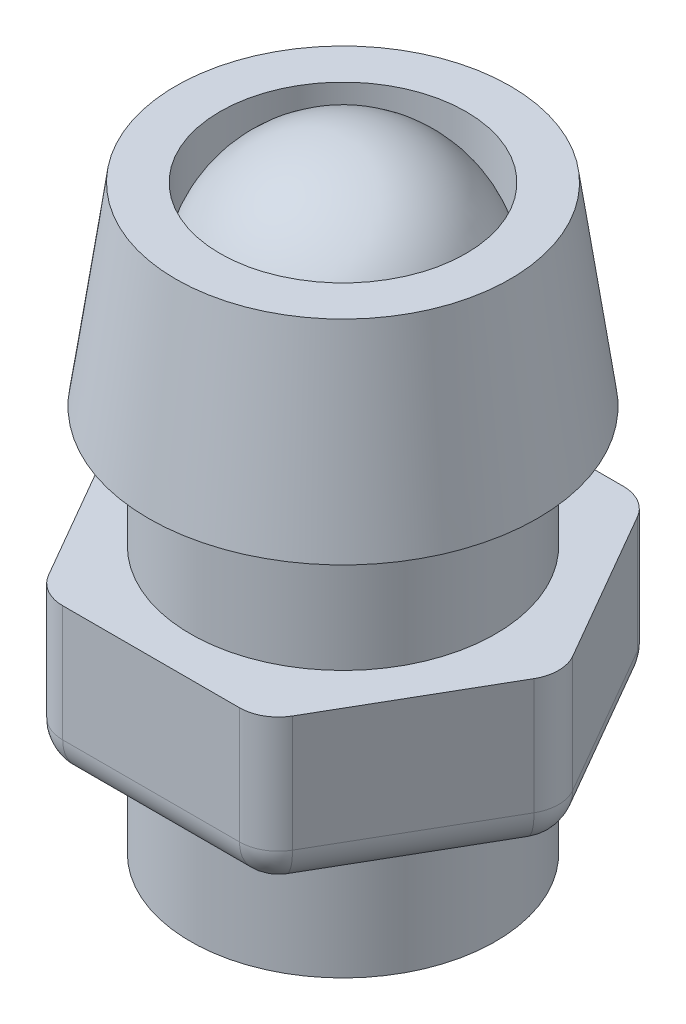
ISO-10303-21;
HEADER;
FILE_DESCRIPTION(('STEP AP214'),'2;1');
FILE_NAME('part.step','',(''),(''),'','','');
FILE_SCHEMA(('AUTOMOTIVE_DESIGN { 1 0 10303 214 1 1 1 1 }'));
ENDSEC;
DATA;
#1=APPLICATION_CONTEXT('core data for automotive mechanical design processes');
#2=APPLICATION_PROTOCOL_DEFINITION('international standard','automotive_design',2000,#1);
#3=PRODUCT_CONTEXT('',#1,'mechanical');
#4=PRODUCT('Part','Part','',(#3));
#5=PRODUCT_RELATED_PRODUCT_CATEGORY('part','',(#4));
#6=PRODUCT_DEFINITION_FORMATION('','',#4);
#7=PRODUCT_DEFINITION_CONTEXT('part definition',#1,'design');
#8=PRODUCT_DEFINITION('design','',#6,#7);
#9=PRODUCT_DEFINITION_SHAPE('','',#8);
#10=(LENGTH_UNIT() NAMED_UNIT(*) SI_UNIT(.MILLI.,.METRE.));
#11=(NAMED_UNIT(*) PLANE_ANGLE_UNIT() SI_UNIT($,.RADIAN.));
#12=(NAMED_UNIT(*) SI_UNIT($,.STERADIAN.) SOLID_ANGLE_UNIT());
#13=UNCERTAINTY_MEASURE_WITH_UNIT(LENGTH_MEASURE(1.E-05),#10,'distance_accuracy_value','');
#14=(GEOMETRIC_REPRESENTATION_CONTEXT(3) GLOBAL_UNCERTAINTY_ASSIGNED_CONTEXT((#13)) GLOBAL_UNIT_ASSIGNED_CONTEXT((#10,
#11,#12)) REPRESENTATION_CONTEXT('',''));
#15=CARTESIAN_POINT('',(0.,0.,0.));
#16=DIRECTION('',(0.,0.,1.));
#17=DIRECTION('',(1.,0.,0.));
#18=AXIS2_PLACEMENT_3D('',#15,#16,#17);
#19=CARTESIAN_POINT('',(0.,12.7,0.));
#20=DIRECTION('',(0.,-1.,0.));
#21=DIRECTION('',(1.,0.,0.));
#22=AXIS2_PLACEMENT_3D('',#19,#20,#21);
#23=SPHERICAL_SURFACE('',#22,3.3);
#24=CARTESIAN_POINT('',(0.,13.5996527107723,0.));
#25=DIRECTION('',(0.,-1.,0.));
#26=DIRECTION('',(0.,0.,-1.));
#27=AXIS2_PLACEMENT_3D('',#24,#25,#26);
#28=CIRCLE('',#27,3.175);
#29=CARTESIAN_POINT('',(0.,13.5996527107723,-3.175));
#30=VERTEX_POINT('',#29);
#31=EDGE_CURVE('E11',#30,#30,#28,.T.);
#32=ORIENTED_EDGE('',*,*,#31,.F.);
#33=EDGE_LOOP('',(#32));
#34=FACE_BOUND('',#33,.T.);
#35=ADVANCED_FACE('F48',(#34),#23,.T.);
#36=CARTESIAN_POINT('',(0.,13.5996527107723,0.));
#37=DIRECTION('',(0.,-1.,0.));
#38=DIRECTION('',(0.,0.,-1.));
#39=AXIS2_PLACEMENT_3D('',#36,#37,#38);
#40=PLANE('',#39);
#41=ORIENTED_EDGE('',*,*,#31,.T.);
#42=EDGE_LOOP('',(#41));
#43=FACE_BOUND('',#42,.T.);
#44=ADVANCED_FACE('F55',(#43),#40,.T.);
#45=CLOSED_SHELL('',(#35,#44));
#46=MANIFOLD_SOLID_BREP('B2',#45);
#47=CARTESIAN_POINT('',(0.,0.,0.));
#48=DIRECTION('',(0.,-1.,0.));
#49=DIRECTION('',(0.,0.,-1.));
#50=AXIS2_PLACEMENT_3D('',#47,#48,#49);
#51=CYLINDRICAL_SURFACE('',#50,3.937);
#52=CARTESIAN_POINT('',(0.,9.99999999999999,0.));
#53=DIRECTION('',(0.,-1.,0.));
#54=DIRECTION('',(0.,0.,-1.));
#55=AXIS2_PLACEMENT_3D('',#52,#53,#54);
#56=CIRCLE('',#55,3.937);
#57=CARTESIAN_POINT('',(0.,9.99999999999999,-3.937));
#58=VERTEX_POINT('',#57);
#59=EDGE_CURVE('E237',#58,#58,#56,.T.);
#60=ORIENTED_EDGE('',*,*,#59,.T.);
#61=EDGE_LOOP('',(#60));
#62=FACE_BOUND('',#61,.T.);
#63=CARTESIAN_POINT('',(0.,6.87499999999999,0.));
#64=DIRECTION('',(0.,-1.,0.));
#65=DIRECTION('',(0.,0.,-1.));
#66=AXIS2_PLACEMENT_3D('',#63,#64,#65);
#67=CIRCLE('',#66,3.937);
#68=CARTESIAN_POINT('',(0.,6.87499999999999,-3.937));
#69=VERTEX_POINT('',#68);
#70=EDGE_CURVE('E215',#69,#69,#67,.F.);
#71=ORIENTED_EDGE('',*,*,#70,.T.);
#72=EDGE_LOOP('',(#71));
#73=FACE_BOUND('',#72,.T.);
#74=ADVANCED_FACE('F75',(#62,#73),#51,.T.);
#75=CARTESIAN_POINT('',(0.,0.,0.));
#76=DIRECTION('',(0.,1.,0.));
#77=DIRECTION('',(0.,0.,1.));
#78=AXIS2_PLACEMENT_3D('',#75,#76,#77);
#79=CYLINDRICAL_SURFACE('',#78,3.175);
#80=CARTESIAN_POINT('',(0.,15.,0.));
#81=DIRECTION('',(0.,1.,0.));
#82=DIRECTION('',(0.,0.,1.));
#83=AXIS2_PLACEMENT_3D('',#80,#81,#82);
#84=CIRCLE('',#83,3.175);
#85=CARTESIAN_POINT('',(0.,15.,3.175));
#86=VERTEX_POINT('',#85);
#87=EDGE_CURVE('E232',#86,#86,#84,.T.);
#88=ORIENTED_EDGE('',*,*,#87,.T.);
#89=EDGE_LOOP('',(#88));
#90=FACE_BOUND('',#89,.T.);
#91=CARTESIAN_POINT('',(0.,6.87499999999999,0.));
#92=DIRECTION('',(0.,-1.,0.));
#93=DIRECTION('',(0.,0.,-1.));
#94=AXIS2_PLACEMENT_3D('',#91,#92,#93);
#95=CIRCLE('',#94,3.175);
#96=CARTESIAN_POINT('',(0.,6.87499999999999,-3.175));
#97=VERTEX_POINT('',#96);
#98=EDGE_CURVE('E227',#97,#97,#95,.F.);
#99=ORIENTED_EDGE('',*,*,#98,.F.);
#100=EDGE_LOOP('',(#99));
#101=FACE_BOUND('',#100,.T.);
#102=ADVANCED_FACE('F455',(#90,#101),#79,.F.);
#103=CARTESIAN_POINT('',(0.,15.,0.));
#104=DIRECTION('',(0.,1.,0.));
#105=DIRECTION('',(0.,0.,1.));
#106=AXIS2_PLACEMENT_3D('',#103,#104,#105);
#107=PLANE('',#106);
#108=ORIENTED_EDGE('',*,*,#87,.F.);
#109=EDGE_LOOP('',(#108));
#110=FACE_BOUND('',#109,.T.);
#111=CARTESIAN_POINT('',(0.,15.,0.));
#112=DIRECTION('',(0.,-1.,0.));
#113=DIRECTION('',(0.,0.,-1.));
#114=AXIS2_PLACEMENT_3D('',#111,#112,#113);
#115=CIRCLE('',#114,4.318);
#116=CARTESIAN_POINT('',(0.,15.,-4.318));
#117=VERTEX_POINT('',#116);
#118=EDGE_CURVE('E243',#117,#117,#115,.T.);
#119=ORIENTED_EDGE('',*,*,#118,.F.);
#120=EDGE_LOOP('',(#119));
#121=FACE_BOUND('',#120,.T.);
#122=ADVANCED_FACE('F463',(#110,#121),#107,.T.);
#123=CARTESIAN_POINT('',(0.,10.,0.));
#124=DIRECTION('',(0.,-1.,0.));
#125=DIRECTION('',(0.,0.,-1.));
#126=AXIS2_PLACEMENT_3D('',#123,#124,#125);
#127=CONICAL_SURFACE('',#126,5.02070417351192,0.139626340159539);
#128=ORIENTED_EDGE('',*,*,#118,.T.);
#129=EDGE_LOOP('',(#128));
#130=FACE_BOUND('',#129,.T.);
#131=CARTESIAN_POINT('',(0.,10.,0.));
#132=DIRECTION('',(0.,-1.,0.));
#133=DIRECTION('',(0.,0.,-1.));
#134=AXIS2_PLACEMENT_3D('',#131,#132,#133);
#135=CIRCLE('',#134,5.02070417351192);
#136=CARTESIAN_POINT('',(0.,10.,-5.02070417351192));
#137=VERTEX_POINT('',#136);
#138=EDGE_CURVE('E240',#137,#137,#135,.T.);
#139=ORIENTED_EDGE('',*,*,#138,.F.);
#140=EDGE_LOOP('',(#139));
#141=FACE_BOUND('',#140,.T.);
#142=ADVANCED_FACE('F472',(#130,#141),#127,.T.);
#143=CARTESIAN_POINT('',(5.02070417351192,9.99999999999999,0.));
#144=DIRECTION('',(0.,-1.,0.));
#145=DIRECTION('',(0.,0.,-1.));
#146=AXIS2_PLACEMENT_3D('',#143,#144,#145);
#147=PLANE('',#146);
#148=ORIENTED_EDGE('',*,*,#138,.T.);
#149=EDGE_LOOP('',(#148));
#150=FACE_BOUND('',#149,.T.);
#151=ORIENTED_EDGE('',*,*,#59,.F.);
#152=EDGE_LOOP('',(#151));
#153=FACE_BOUND('',#152,.T.);
#154=ADVANCED_FACE('F468',(#150,#153),#147,.T.);
#155=CARTESIAN_POINT('',(0.,6.87499999999999,0.));
#156=DIRECTION('',(0.,-1.,0.));
#157=DIRECTION('',(0.,0.,-1.));
#158=AXIS2_PLACEMENT_3D('',#155,#156,#157);
#159=PLANE('',#158);
#160=ORIENTED_EDGE('',*,*,#98,.T.);
#161=EDGE_LOOP('',(#160));
#162=FACE_BOUND('',#161,.T.);
#163=ADVANCED_FACE('F471',(#162),#159,.F.);
#164=CARTESIAN_POINT('',(-2.85961588329622,2.87499999999999,4.953));
#165=DIRECTION('',(0.866025403784439,0.,-0.5));
#166=DIRECTION('',(-0.5,0.,-0.866025403784439));
#167=AXIS2_PLACEMENT_3D('',#164,#165,#166);
#168=PLANE('',#167);
#169=DIRECTION('',(0.,1.,0.));
#170=VECTOR('',#169,1.);
#171=CARTESIAN_POINT('',(-5.43055663199762,2.87499999999999,0.5));
#172=LINE('',#171,#170);
#173=CARTESIAN_POINT('',(-5.43055663199762,6.87499999999999,0.5));
#174=VERTEX_POINT('',#173);
#175=CARTESIAN_POINT('',(-5.43055663199762,3.87499999999999,0.5));
#176=VERTEX_POINT('',#175);
#177=EDGE_CURVE('E272',#174,#176,#172,.F.);
#178=ORIENTED_EDGE('',*,*,#177,.T.);
#179=DIRECTION('',(-0.5,0.,-0.866025403784439));
#180=VECTOR('',#179,1.);
#181=CARTESIAN_POINT('',(-3.14829101789103,3.87499999999999,4.453));
#182=LINE('',#181,#180);
#183=CARTESIAN_POINT('',(-3.14829101789103,3.87499999999999,4.453));
#184=VERTEX_POINT('',#183);
#185=EDGE_CURVE('E300',#176,#184,#182,.F.);
#186=ORIENTED_EDGE('',*,*,#185,.T.);
#187=DIRECTION('',(0.,1.,0.));
#188=VECTOR('',#187,1.);
#189=CARTESIAN_POINT('',(-3.14829101789103,2.87499999999999,4.453));
#190=LINE('',#189,#188);
#191=CARTESIAN_POINT('',(-3.14829101789103,6.87499999999999,4.453));
#192=VERTEX_POINT('',#191);
#193=EDGE_CURVE('E270',#184,#192,#190,.T.);
#194=ORIENTED_EDGE('',*,*,#193,.T.);
#195=DIRECTION('',(-0.5,0.,-0.866025403784439));
#196=VECTOR('',#195,1.);
#197=CARTESIAN_POINT('',(-2.85961588329622,6.87499999999999,4.953));
#198=LINE('',#197,#196);
#199=EDGE_CURVE('E347',#192,#174,#198,.T.);
#200=ORIENTED_EDGE('',*,*,#199,.T.);
#201=EDGE_LOOP('',(#178,#186,#194,#200));
#202=FACE_BOUND('',#201,.T.);
#203=ADVANCED_FACE('F413',(#202),#168,.F.);
#204=CARTESIAN_POINT('',(-5.71923176659243,2.87499999999999,0.));
#205=DIRECTION('',(0.866025403784438,0.,0.5));
#206=DIRECTION('',(0.5,0.,-0.866025403784439));
#207=AXIS2_PLACEMENT_3D('',#204,#205,#206);
#208=PLANE('',#207);
#209=DIRECTION('',(0.,1.,0.));
#210=VECTOR('',#209,1.);
#211=CARTESIAN_POINT('',(-3.14829101789103,2.87499999999999,-4.453));
#212=LINE('',#211,#210);
#213=CARTESIAN_POINT('',(-3.14829101789103,6.87499999999999,-4.453));
#214=VERTEX_POINT('',#213);
#215=CARTESIAN_POINT('',(-3.14829101789103,3.87499999999999,-4.453));
#216=VERTEX_POINT('',#215);
#217=EDGE_CURVE('E267',#214,#216,#212,.F.);
#218=ORIENTED_EDGE('',*,*,#217,.T.);
#219=DIRECTION('',(0.5,0.,-0.866025403784439));
#220=VECTOR('',#219,1.);
#221=CARTESIAN_POINT('',(-5.43055663199762,3.87499999999999,-0.499999999999999));
#222=LINE('',#221,#220);
#223=CARTESIAN_POINT('',(-5.43055663199762,3.87499999999999,-0.5));
#224=VERTEX_POINT('',#223);
#225=EDGE_CURVE('E296',#216,#224,#222,.F.);
#226=ORIENTED_EDGE('',*,*,#225,.T.);
#227=DIRECTION('',(0.,1.,0.));
#228=VECTOR('',#227,1.);
#229=CARTESIAN_POINT('',(-5.43055663199762,2.87499999999999,-0.5));
#230=LINE('',#229,#228);
#231=CARTESIAN_POINT('',(-5.43055663199762,6.87499999999999,-0.5));
#232=VERTEX_POINT('',#231);
#233=EDGE_CURVE('E265',#224,#232,#230,.T.);
#234=ORIENTED_EDGE('',*,*,#233,.T.);
#235=DIRECTION('',(0.5,0.,-0.866025403784439));
#236=VECTOR('',#235,1.);
#237=CARTESIAN_POINT('',(-5.71923176659243,6.87499999999999,0.));
#238=LINE('',#237,#236);
#239=EDGE_CURVE('E352',#232,#214,#238,.T.);
#240=ORIENTED_EDGE('',*,*,#239,.T.);
#241=EDGE_LOOP('',(#218,#226,#234,#240));
#242=FACE_BOUND('',#241,.T.);
#243=ADVANCED_FACE('F398',(#242),#208,.F.);
#244=CARTESIAN_POINT('',(-2.85961588329621,2.87499999999999,-4.953));
#245=DIRECTION('',(0.,0.,1.));
#246=DIRECTION('',(1.,0.,0.));
#247=AXIS2_PLACEMENT_3D('',#244,#245,#246);
#248=PLANE('',#247);
#249=DIRECTION('',(0.,1.,0.));
#250=VECTOR('',#249,1.);
#251=CARTESIAN_POINT('',(2.28226561410659,2.87499999999999,-4.953));
#252=LINE('',#251,#250);
#253=CARTESIAN_POINT('',(2.28226561410659,6.87499999999999,-4.953));
#254=VERTEX_POINT('',#253);
#255=CARTESIAN_POINT('',(2.28226561410659,3.87499999999999,-4.953));
#256=VERTEX_POINT('',#255);
#257=EDGE_CURVE('E263',#254,#256,#252,.F.);
#258=ORIENTED_EDGE('',*,*,#257,.T.);
#259=DIRECTION('',(1.,0.,0.));
#260=VECTOR('',#259,1.);
#261=CARTESIAN_POINT('',(-2.28226561410659,3.87499999999999,-4.953));
#262=LINE('',#261,#260);
#263=CARTESIAN_POINT('',(-2.28226561410659,3.87499999999999,-4.953));
#264=VERTEX_POINT('',#263);
#265=EDGE_CURVE('E46',#256,#264,#262,.F.);
#266=ORIENTED_EDGE('',*,*,#265,.T.);
#267=DIRECTION('',(0.,1.,0.));
#268=VECTOR('',#267,1.);
#269=CARTESIAN_POINT('',(-2.28226561410659,2.87499999999999,-4.953));
#270=LINE('',#269,#268);
#271=CARTESIAN_POINT('',(-2.28226561410659,6.87499999999999,-4.953));
#272=VERTEX_POINT('',#271);
#273=EDGE_CURVE('E261',#264,#272,#270,.T.);
#274=ORIENTED_EDGE('',*,*,#273,.T.);
#275=DIRECTION('',(1.,0.,0.));
#276=VECTOR('',#275,1.);
#277=CARTESIAN_POINT('',(-2.85961588329621,6.87499999999999,-4.953));
#278=LINE('',#277,#276);
#279=EDGE_CURVE('E217',#272,#254,#278,.T.);
#280=ORIENTED_EDGE('',*,*,#279,.T.);
#281=EDGE_LOOP('',(#258,#266,#274,#280));
#282=FACE_BOUND('',#281,.T.);
#283=ADVANCED_FACE('F362',(#282),#248,.F.);
#284=CARTESIAN_POINT('',(2.85961588329622,2.87499999999999,-4.953));
#285=DIRECTION('',(-0.866025403784439,0.,0.5));
#286=DIRECTION('',(0.5,0.,0.866025403784439));
#287=AXIS2_PLACEMENT_3D('',#284,#285,#286);
#288=PLANE('',#287);
#289=DIRECTION('',(0.,1.,0.));
#290=VECTOR('',#289,1.);
#291=CARTESIAN_POINT('',(5.43055663199762,2.87499999999999,-0.499999999999999));
#292=LINE('',#291,#290);
#293=CARTESIAN_POINT('',(5.43055663199762,6.87499999999999,-0.499999999999999));
#294=VERTEX_POINT('',#293);
#295=CARTESIAN_POINT('',(5.43055663199762,3.87499999999999,-0.499999999999999));
#296=VERTEX_POINT('',#295);
#297=EDGE_CURVE('E201',#294,#296,#292,.F.);
#298=ORIENTED_EDGE('',*,*,#297,.T.);
#299=DIRECTION('',(0.5,0.,0.866025403784439));
#300=VECTOR('',#299,1.);
#301=CARTESIAN_POINT('',(3.14829101789103,3.87499999999999,-4.453));
#302=LINE('',#301,#300);
#303=CARTESIAN_POINT('',(3.14829101789103,3.87499999999999,-4.453));
#304=VERTEX_POINT('',#303);
#305=EDGE_CURVE('E99',#296,#304,#302,.F.);
#306=ORIENTED_EDGE('',*,*,#305,.T.);
#307=DIRECTION('',(0.,1.,0.));
#308=VECTOR('',#307,1.);
#309=CARTESIAN_POINT('',(3.14829101789103,2.87499999999999,-4.453));
#310=LINE('',#309,#308);
#311=CARTESIAN_POINT('',(3.14829101789103,6.87499999999999,-4.453));
#312=VERTEX_POINT('',#311);
#313=EDGE_CURVE('E205',#304,#312,#310,.T.);
#314=ORIENTED_EDGE('',*,*,#313,.T.);
#315=DIRECTION('',(0.5,0.,0.866025403784439));
#316=VECTOR('',#315,1.);
#317=CARTESIAN_POINT('',(2.85961588329622,6.87499999999999,-4.953));
#318=LINE('',#317,#316);
#319=EDGE_CURVE('E212',#312,#294,#318,.T.);
#320=ORIENTED_EDGE('',*,*,#319,.T.);
#321=EDGE_LOOP('',(#298,#306,#314,#320));
#322=FACE_BOUND('',#321,.T.);
#323=ADVANCED_FACE('F369',(#322),#288,.F.);
#324=CARTESIAN_POINT('',(5.71923176659243,2.87499999999999,0.));
#325=DIRECTION('',(-0.866025403784438,0.,-0.5));
#326=DIRECTION('',(-0.5,0.,0.866025403784438));
#327=AXIS2_PLACEMENT_3D('',#324,#325,#326);
#328=PLANE('',#327);
#329=DIRECTION('',(0.,1.,0.));
#330=VECTOR('',#329,1.);
#331=CARTESIAN_POINT('',(3.14829101789103,2.87499999999999,4.453));
#332=LINE('',#331,#330);
#333=CARTESIAN_POINT('',(3.14829101789103,6.87499999999999,4.453));
#334=VERTEX_POINT('',#333);
#335=CARTESIAN_POINT('',(3.14829101789103,3.87499999999999,4.453));
#336=VERTEX_POINT('',#335);
#337=EDGE_CURVE('E196',#334,#336,#332,.F.);
#338=ORIENTED_EDGE('',*,*,#337,.T.);
#339=DIRECTION('',(-0.5,0.,0.866025403784438));
#340=VECTOR('',#339,1.);
#341=CARTESIAN_POINT('',(5.43055663199762,3.87499999999999,0.500000000000001));
#342=LINE('',#341,#340);
#343=CARTESIAN_POINT('',(5.43055663199762,3.87499999999999,0.500000000000001));
#344=VERTEX_POINT('',#343);
#345=EDGE_CURVE('E192',#336,#344,#342,.F.);
#346=ORIENTED_EDGE('',*,*,#345,.T.);
#347=DIRECTION('',(0.,1.,0.));
#348=VECTOR('',#347,1.);
#349=CARTESIAN_POINT('',(5.43055663199762,2.87499999999999,0.500000000000001));
#350=LINE('',#349,#348);
#351=CARTESIAN_POINT('',(5.43055663199762,6.87499999999999,0.500000000000001));
#352=VERTEX_POINT('',#351);
#353=EDGE_CURVE('E184',#344,#352,#350,.T.);
#354=ORIENTED_EDGE('',*,*,#353,.T.);
#355=DIRECTION('',(-0.5,0.,0.866025403784438));
#356=VECTOR('',#355,1.);
#357=CARTESIAN_POINT('',(5.71923176659243,6.87499999999999,0.));
#358=LINE('',#357,#356);
#359=EDGE_CURVE('E189',#352,#334,#358,.T.);
#360=ORIENTED_EDGE('',*,*,#359,.T.);
#361=EDGE_LOOP('',(#338,#346,#354,#360));
#362=FACE_BOUND('',#361,.T.);
#363=ADVANCED_FACE('F187',(#362),#328,.F.);
#364=CARTESIAN_POINT('',(2.85961588329622,2.87499999999999,4.953));
#365=DIRECTION('',(0.,0.,-1.));
#366=DIRECTION('',(-1.,0.,0.));
#367=AXIS2_PLACEMENT_3D('',#364,#365,#366);
#368=PLANE('',#367);
#369=DIRECTION('',(0.,1.,0.));
#370=VECTOR('',#369,1.);
#371=CARTESIAN_POINT('',(-2.28226561410659,2.87499999999999,4.953));
#372=LINE('',#371,#370);
#373=CARTESIAN_POINT('',(-2.28226561410659,6.87499999999999,4.953));
#374=VERTEX_POINT('',#373);
#375=CARTESIAN_POINT('',(-2.28226561410659,3.87499999999999,4.953));
#376=VERTEX_POINT('',#375);
#377=EDGE_CURVE('E277',#374,#376,#372,.F.);
#378=ORIENTED_EDGE('',*,*,#377,.T.);
#379=DIRECTION('',(-1.,0.,0.));
#380=VECTOR('',#379,1.);
#381=CARTESIAN_POINT('',(2.28226561410659,3.87499999999999,4.953));
#382=LINE('',#381,#380);
#383=CARTESIAN_POINT('',(2.28226561410659,3.87499999999999,4.953));
#384=VERTEX_POINT('',#383);
#385=EDGE_CURVE('E304',#376,#384,#382,.F.);
#386=ORIENTED_EDGE('',*,*,#385,.T.);
#387=DIRECTION('',(0.,1.,0.));
#388=VECTOR('',#387,1.);
#389=CARTESIAN_POINT('',(2.28226561410659,2.87499999999999,4.953));
#390=LINE('',#389,#388);
#391=CARTESIAN_POINT('',(2.28226561410659,6.87499999999999,4.953));
#392=VERTEX_POINT('',#391);
#393=EDGE_CURVE('E275',#384,#392,#390,.T.);
#394=ORIENTED_EDGE('',*,*,#393,.T.);
#395=DIRECTION('',(-1.,0.,0.));
#396=VECTOR('',#395,1.);
#397=CARTESIAN_POINT('',(2.85961588329622,6.87499999999999,4.953));
#398=LINE('',#397,#396);
#399=EDGE_CURVE('E211',#392,#374,#398,.T.);
#400=ORIENTED_EDGE('',*,*,#399,.T.);
#401=EDGE_LOOP('',(#378,#386,#394,#400));
#402=FACE_BOUND('',#401,.T.);
#403=ADVANCED_FACE('F425',(#402),#368,.F.);
#404=CARTESIAN_POINT('',(0.,2.87499999999999,0.));
#405=DIRECTION('',(0.,-1.,0.));
#406=DIRECTION('',(0.,0.,-1.));
#407=AXIS2_PLACEMENT_3D('',#404,#405,#406);
#408=PLANE('',#407);
#409=DIRECTION('',(-0.5,0.,-0.866025403784439));
#410=VECTOR('',#409,1.);
#411=CARTESIAN_POINT('',(-4.56453122821318,2.87499999999999,0.));
#412=LINE('',#411,#410);
#413=CARTESIAN_POINT('',(-2.28226561410659,2.87499999999999,3.953));
#414=VERTEX_POINT('',#413);
#415=CARTESIAN_POINT('',(-4.56453122821318,2.87499999999999,0.));
#416=VERTEX_POINT('',#415);
#417=EDGE_CURVE('E291',#414,#416,#412,.T.);
#418=ORIENTED_EDGE('',*,*,#417,.T.);
#419=DIRECTION('',(0.5,0.,-0.866025403784439));
#420=VECTOR('',#419,1.);
#421=CARTESIAN_POINT('',(-2.28226561410659,2.87499999999999,-3.953));
#422=LINE('',#421,#420);
#423=CARTESIAN_POINT('',(-2.28226561410659,2.87499999999999,-3.953));
#424=VERTEX_POINT('',#423);
#425=EDGE_CURVE('E293',#416,#424,#422,.T.);
#426=ORIENTED_EDGE('',*,*,#425,.T.);
#427=DIRECTION('',(1.,0.,0.));
#428=VECTOR('',#427,1.);
#429=CARTESIAN_POINT('',(2.28226561410659,2.87499999999999,-3.953));
#430=LINE('',#429,#428);
#431=CARTESIAN_POINT('',(2.28226561410659,2.87499999999999,-3.953));
#432=VERTEX_POINT('',#431);
#433=EDGE_CURVE('E283',#424,#432,#430,.T.);
#434=ORIENTED_EDGE('',*,*,#433,.T.);
#435=DIRECTION('',(0.5,0.,0.866025403784439));
#436=VECTOR('',#435,1.);
#437=CARTESIAN_POINT('',(4.56453122821318,2.87499999999999,0.));
#438=LINE('',#437,#436);
#439=CARTESIAN_POINT('',(4.56453122821318,2.87499999999999,0.));
#440=VERTEX_POINT('',#439);
#441=EDGE_CURVE('E285',#432,#440,#438,.T.);
#442=ORIENTED_EDGE('',*,*,#441,.T.);
#443=DIRECTION('',(-0.5,0.,0.866025403784438));
#444=VECTOR('',#443,1.);
#445=CARTESIAN_POINT('',(2.28226561410659,2.87499999999999,3.953));
#446=LINE('',#445,#444);
#447=CARTESIAN_POINT('',(2.28226561410659,2.87499999999999,3.953));
#448=VERTEX_POINT('',#447);
#449=EDGE_CURVE('E287',#440,#448,#446,.T.);
#450=ORIENTED_EDGE('',*,*,#449,.T.);
#451=DIRECTION('',(-1.,0.,0.));
#452=VECTOR('',#451,1.);
#453=CARTESIAN_POINT('',(-2.28226561410659,2.87499999999999,3.953));
#454=LINE('',#453,#452);
#455=EDGE_CURVE('E289',#448,#414,#454,.T.);
#456=ORIENTED_EDGE('',*,*,#455,.T.);
#457=EDGE_LOOP('',(#418,#426,#434,#442,#450,#456));
#458=FACE_BOUND('',#457,.T.);
#459=CARTESIAN_POINT('',(0.,2.87499999999999,0.));
#460=DIRECTION('',(0.,-1.,0.));
#461=DIRECTION('',(0.,0.,-1.));
#462=AXIS2_PLACEMENT_3D('',#459,#460,#461);
#463=CIRCLE('',#462,3.937);
#464=CARTESIAN_POINT('',(0.,2.87499999999999,-3.937));
#465=VERTEX_POINT('',#464);
#466=EDGE_CURVE('E224',#465,#465,#463,.F.);
#467=ORIENTED_EDGE('',*,*,#466,.T.);
#468=EDGE_LOOP('',(#467));
#469=FACE_BOUND('',#468,.T.);
#470=ADVANCED_FACE('F432',(#458,#469),#408,.T.);
#471=ORIENTED_EDGE('',*,*,#70,.F.);
#472=EDGE_LOOP('',(#471));
#473=FACE_BOUND('',#472,.T.);
#474=ORIENTED_EDGE('',*,*,#359,.F.);
#475=CARTESIAN_POINT('',(4.56453122821318,6.87499999999999,0.));
#476=DIRECTION('',(0.,-1.,0.));
#477=DIRECTION('',(0.,0.,-1.));
#478=AXIS2_PLACEMENT_3D('',#475,#476,#477);
#479=CIRCLE('',#478,1.);
#480=EDGE_CURVE('E199',#352,#294,#479,.F.);
#481=ORIENTED_EDGE('',*,*,#480,.T.);
#482=ORIENTED_EDGE('',*,*,#319,.F.);
#483=CARTESIAN_POINT('',(2.28226561410659,6.87499999999999,-3.953));
#484=DIRECTION('',(0.,-1.,0.));
#485=DIRECTION('',(0.,0.,-1.));
#486=AXIS2_PLACEMENT_3D('',#483,#484,#485);
#487=CIRCLE('',#486,1.);
#488=EDGE_CURVE('E206',#312,#254,#487,.F.);
#489=ORIENTED_EDGE('',*,*,#488,.T.);
#490=ORIENTED_EDGE('',*,*,#279,.F.);
#491=CARTESIAN_POINT('',(-2.28226561410659,6.87499999999999,-3.953));
#492=DIRECTION('',(0.,-1.,0.));
#493=DIRECTION('',(0.,0.,-1.));
#494=AXIS2_PLACEMENT_3D('',#491,#492,#493);
#495=CIRCLE('',#494,1.);
#496=EDGE_CURVE('E256',#272,#214,#495,.F.);
#497=ORIENTED_EDGE('',*,*,#496,.T.);
#498=ORIENTED_EDGE('',*,*,#239,.F.);
#499=CARTESIAN_POINT('',(-4.56453122821318,6.87499999999999,0.));
#500=DIRECTION('',(0.,-1.,0.));
#501=DIRECTION('',(0.,0.,-1.));
#502=AXIS2_PLACEMENT_3D('',#499,#500,#501);
#503=CIRCLE('',#502,1.);
#504=EDGE_CURVE('E254',#232,#174,#503,.F.);
#505=ORIENTED_EDGE('',*,*,#504,.T.);
#506=ORIENTED_EDGE('',*,*,#199,.F.);
#507=CARTESIAN_POINT('',(-2.28226561410659,6.87499999999999,3.953));
#508=DIRECTION('',(0.,-1.,0.));
#509=DIRECTION('',(0.,0.,-1.));
#510=AXIS2_PLACEMENT_3D('',#507,#508,#509);
#511=CIRCLE('',#510,1.);
#512=EDGE_CURVE('E252',#192,#374,#511,.F.);
#513=ORIENTED_EDGE('',*,*,#512,.T.);
#514=ORIENTED_EDGE('',*,*,#399,.F.);
#515=CARTESIAN_POINT('',(2.28226561410659,6.87499999999999,3.953));
#516=DIRECTION('',(0.,-1.,0.));
#517=DIRECTION('',(0.,0.,-1.));
#518=AXIS2_PLACEMENT_3D('',#515,#516,#517);
#519=CIRCLE('',#518,1.);
#520=EDGE_CURVE('E195',#392,#334,#519,.F.);
#521=ORIENTED_EDGE('',*,*,#520,.T.);
#522=EDGE_LOOP('',(#474,#481,#482,#489,#490,#497,#498,#505,#506,#513,#514,#521));
#523=FACE_BOUND('',#522,.T.);
#524=ADVANCED_FACE('F208',(#473,#523),#159,.F.);
#525=ORIENTED_EDGE('',*,*,#466,.F.);
#526=EDGE_LOOP('',(#525));
#527=FACE_BOUND('',#526,.T.);
#528=CARTESIAN_POINT('',(0.,0.,0.));
#529=DIRECTION('',(0.,-1.,0.));
#530=DIRECTION('',(0.,0.,-1.));
#531=AXIS2_PLACEMENT_3D('',#528,#529,#530);
#532=CIRCLE('',#531,3.937);
#533=CARTESIAN_POINT('',(0.,0.,-3.937));
#534=VERTEX_POINT('',#533);
#535=EDGE_CURVE('E231',#534,#534,#532,.T.);
#536=ORIENTED_EDGE('',*,*,#535,.F.);
#537=EDGE_LOOP('',(#536));
#538=FACE_BOUND('',#537,.T.);
#539=ADVANCED_FACE('F439',(#527,#538),#51,.T.);
#540=CARTESIAN_POINT('',(3.937,0.,0.));
#541=DIRECTION('',(0.,-1.,0.));
#542=DIRECTION('',(0.,0.,-1.));
#543=AXIS2_PLACEMENT_3D('',#540,#541,#542);
#544=PLANE('',#543);
#545=CARTESIAN_POINT('',(0.,0.,0.));
#546=DIRECTION('',(0.,1.,0.));
#547=DIRECTION('',(0.,0.,1.));
#548=AXIS2_PLACEMENT_3D('',#545,#546,#547);
#549=CIRCLE('',#548,3.175);
#550=CARTESIAN_POINT('',(0.,0.,3.175));
#551=VERTEX_POINT('',#550);
#552=EDGE_CURVE('E228',#551,#551,#549,.T.);
#553=ORIENTED_EDGE('',*,*,#552,.T.);
#554=EDGE_LOOP('',(#553));
#555=FACE_BOUND('',#554,.T.);
#556=ORIENTED_EDGE('',*,*,#535,.T.);
#557=EDGE_LOOP('',(#556));
#558=FACE_BOUND('',#557,.T.);
#559=ADVANCED_FACE('F442',(#555,#558),#544,.T.);
#560=CARTESIAN_POINT('',(0.,2.87499999999999,0.));
#561=DIRECTION('',(0.,-1.,0.));
#562=DIRECTION('',(0.,0.,-1.));
#563=AXIS2_PLACEMENT_3D('',#560,#561,#562);
#564=CIRCLE('',#563,3.175);
#565=CARTESIAN_POINT('',(0.,2.87499999999999,-3.175));
#566=VERTEX_POINT('',#565);
#567=EDGE_CURVE('E223',#566,#566,#564,.F.);
#568=ORIENTED_EDGE('',*,*,#567,.T.);
#569=EDGE_LOOP('',(#568));
#570=FACE_BOUND('',#569,.T.);
#571=ORIENTED_EDGE('',*,*,#552,.F.);
#572=EDGE_LOOP('',(#571));
#573=FACE_BOUND('',#572,.T.);
#574=ADVANCED_FACE('F447',(#570,#573),#79,.F.);
#575=ORIENTED_EDGE('',*,*,#567,.F.);
#576=EDGE_LOOP('',(#575));
#577=FACE_BOUND('',#576,.T.);
#578=ADVANCED_FACE('F436',(#577),#408,.T.);
#579=CARTESIAN_POINT('',(4.56453122821318,2.87499999999999,0.));
#580=DIRECTION('',(0.,1.,0.));
#581=DIRECTION('',(0.,0.,1.));
#582=AXIS2_PLACEMENT_3D('',#579,#580,#581);
#583=CYLINDRICAL_SURFACE('',#582,1.);
#584=ORIENTED_EDGE('',*,*,#353,.F.);
#585=CARTESIAN_POINT('',(4.56453122821318,3.87499999999999,0.));
#586=DIRECTION('',(0.,1.,0.));
#587=DIRECTION('',(0.,0.,1.));
#588=AXIS2_PLACEMENT_3D('',#585,#586,#587);
#589=CIRCLE('',#588,1.);
#590=EDGE_CURVE('E309',#344,#296,#589,.T.);
#591=ORIENTED_EDGE('',*,*,#590,.T.);
#592=ORIENTED_EDGE('',*,*,#297,.F.);
#593=ORIENTED_EDGE('',*,*,#480,.F.);
#594=EDGE_LOOP('',(#584,#591,#592,#593));
#595=FACE_BOUND('',#594,.T.);
#596=ADVANCED_FACE('F200',(#595),#583,.T.);
#597=CARTESIAN_POINT('',(2.28226561410659,2.87499999999999,-3.953));
#598=DIRECTION('',(0.,1.,0.));
#599=DIRECTION('',(0.,0.,1.));
#600=AXIS2_PLACEMENT_3D('',#597,#598,#599);
#601=CYLINDRICAL_SURFACE('',#600,1.);
#602=ORIENTED_EDGE('',*,*,#313,.F.);
#603=CARTESIAN_POINT('',(2.28226561410659,3.87499999999999,-3.953));
#604=DIRECTION('',(0.,1.,0.));
#605=DIRECTION('',(0.,0.,1.));
#606=AXIS2_PLACEMENT_3D('',#603,#604,#605);
#607=CIRCLE('',#606,1.);
#608=EDGE_CURVE('E84',#304,#256,#607,.T.);
#609=ORIENTED_EDGE('',*,*,#608,.T.);
#610=ORIENTED_EDGE('',*,*,#257,.F.);
#611=ORIENTED_EDGE('',*,*,#488,.F.);
#612=EDGE_LOOP('',(#602,#609,#610,#611));
#613=FACE_BOUND('',#612,.T.);
#614=ADVANCED_FACE('F367',(#613),#601,.T.);
#615=CARTESIAN_POINT('',(-2.28226561410659,2.87499999999999,-3.953));
#616=DIRECTION('',(0.,1.,0.));
#617=DIRECTION('',(0.,0.,1.));
#618=AXIS2_PLACEMENT_3D('',#615,#616,#617);
#619=CYLINDRICAL_SURFACE('',#618,1.);
#620=ORIENTED_EDGE('',*,*,#273,.F.);
#621=CARTESIAN_POINT('',(-2.28226561410659,3.87499999999999,-3.953));
#622=DIRECTION('',(0.,1.,0.));
#623=DIRECTION('',(0.,0.,1.));
#624=AXIS2_PLACEMENT_3D('',#621,#622,#623);
#625=CIRCLE('',#624,1.);
#626=EDGE_CURVE('E280',#264,#216,#625,.T.);
#627=ORIENTED_EDGE('',*,*,#626,.T.);
#628=ORIENTED_EDGE('',*,*,#217,.F.);
#629=ORIENTED_EDGE('',*,*,#496,.F.);
#630=EDGE_LOOP('',(#620,#627,#628,#629));
#631=FACE_BOUND('',#630,.T.);
#632=ADVANCED_FACE('F386',(#631),#619,.T.);
#633=CARTESIAN_POINT('',(-4.56453122821318,2.87499999999999,0.));
#634=DIRECTION('',(0.,1.,0.));
#635=DIRECTION('',(0.,0.,1.));
#636=AXIS2_PLACEMENT_3D('',#633,#634,#635);
#637=CYLINDRICAL_SURFACE('',#636,1.);
#638=ORIENTED_EDGE('',*,*,#233,.F.);
#639=CARTESIAN_POINT('',(-4.56453122821318,3.87499999999999,0.));
#640=DIRECTION('',(0.,1.,0.));
#641=DIRECTION('',(0.,0.,1.));
#642=AXIS2_PLACEMENT_3D('',#639,#640,#641);
#643=CIRCLE('',#642,1.);
#644=EDGE_CURVE('E298',#224,#176,#643,.T.);
#645=ORIENTED_EDGE('',*,*,#644,.T.);
#646=ORIENTED_EDGE('',*,*,#177,.F.);
#647=ORIENTED_EDGE('',*,*,#504,.F.);
#648=EDGE_LOOP('',(#638,#645,#646,#647));
#649=FACE_BOUND('',#648,.T.);
#650=ADVANCED_FACE('F402',(#649),#637,.T.);
#651=CARTESIAN_POINT('',(-2.28226561410659,2.87499999999999,3.953));
#652=DIRECTION('',(0.,1.,0.));
#653=DIRECTION('',(0.,0.,1.));
#654=AXIS2_PLACEMENT_3D('',#651,#652,#653);
#655=CYLINDRICAL_SURFACE('',#654,1.);
#656=ORIENTED_EDGE('',*,*,#193,.F.);
#657=CARTESIAN_POINT('',(-2.28226561410659,3.87499999999999,3.953));
#658=DIRECTION('',(0.,1.,0.));
#659=DIRECTION('',(0.,0.,1.));
#660=AXIS2_PLACEMENT_3D('',#657,#658,#659);
#661=CIRCLE('',#660,1.);
#662=EDGE_CURVE('E302',#184,#376,#661,.T.);
#663=ORIENTED_EDGE('',*,*,#662,.T.);
#664=ORIENTED_EDGE('',*,*,#377,.F.);
#665=ORIENTED_EDGE('',*,*,#512,.F.);
#666=EDGE_LOOP('',(#656,#663,#664,#665));
#667=FACE_BOUND('',#666,.T.);
#668=ADVANCED_FACE('F417',(#667),#655,.T.);
#669=CARTESIAN_POINT('',(2.28226561410659,2.87499999999999,3.953));
#670=DIRECTION('',(0.,1.,0.));
#671=DIRECTION('',(0.,0.,1.));
#672=AXIS2_PLACEMENT_3D('',#669,#670,#671);
#673=CYLINDRICAL_SURFACE('',#672,1.);
#674=ORIENTED_EDGE('',*,*,#393,.F.);
#675=CARTESIAN_POINT('',(2.28226561410659,3.87499999999999,3.953));
#676=DIRECTION('',(0.,1.,0.));
#677=DIRECTION('',(0.,0.,1.));
#678=AXIS2_PLACEMENT_3D('',#675,#676,#677);
#679=CIRCLE('',#678,1.);
#680=EDGE_CURVE('E306',#384,#336,#679,.T.);
#681=ORIENTED_EDGE('',*,*,#680,.T.);
#682=ORIENTED_EDGE('',*,*,#337,.F.);
#683=ORIENTED_EDGE('',*,*,#520,.F.);
#684=EDGE_LOOP('',(#674,#681,#682,#683));
#685=FACE_BOUND('',#684,.T.);
#686=ADVANCED_FACE('F428',(#685),#673,.T.);
#687=CARTESIAN_POINT('',(2.28226561410659,3.87499999999999,3.953));
#688=DIRECTION('',(0.,0.,1.));
#689=DIRECTION('',(1.,0.,0.));
#690=AXIS2_PLACEMENT_3D('',#687,#688,#689);
#691=SPHERICAL_SURFACE('',#690,1.);
#692=CARTESIAN_POINT('',(2.28226561410659,3.87499999999999,3.953));
#693=DIRECTION('',(0.5,0.,-0.866025403784438));
#694=DIRECTION('',(-0.866025403784438,0.,-0.5));
#695=AXIS2_PLACEMENT_3D('',#692,#693,#694);
#696=CIRCLE('',#695,1.);
#697=EDGE_CURVE('E340',#336,#448,#696,.T.);
#698=ORIENTED_EDGE('',*,*,#697,.F.);
#699=ORIENTED_EDGE('',*,*,#680,.F.);
#700=CARTESIAN_POINT('',(2.28226561410659,3.87499999999999,3.953));
#701=DIRECTION('',(-1.,0.,0.));
#702=DIRECTION('',(0.,0.,1.));
#703=AXIS2_PLACEMENT_3D('',#700,#701,#702);
#704=CIRCLE('',#703,1.);
#705=EDGE_CURVE('E79',#448,#384,#704,.T.);
#706=ORIENTED_EDGE('',*,*,#705,.F.);
#707=EDGE_LOOP('',(#698,#699,#706));
#708=FACE_BOUND('',#707,.T.);
#709=ADVANCED_FACE('F77',(#708),#691,.T.);
#710=CARTESIAN_POINT('',(0.,3.87499999999999,3.953));
#711=DIRECTION('',(1.,0.,0.));
#712=DIRECTION('',(0.,0.,-1.));
#713=AXIS2_PLACEMENT_3D('',#710,#711,#712);
#714=CYLINDRICAL_SURFACE('',#713,1.);
#715=ORIENTED_EDGE('',*,*,#705,.T.);
#716=ORIENTED_EDGE('',*,*,#385,.F.);
#717=CARTESIAN_POINT('',(-2.28226561410659,3.87499999999999,3.953));
#718=DIRECTION('',(-1.,0.,0.));
#719=DIRECTION('',(0.,0.,1.));
#720=AXIS2_PLACEMENT_3D('',#717,#718,#719);
#721=CIRCLE('',#720,1.);
#722=EDGE_CURVE('E338',#414,#376,#721,.T.);
#723=ORIENTED_EDGE('',*,*,#722,.F.);
#724=ORIENTED_EDGE('',*,*,#455,.F.);
#725=EDGE_LOOP('',(#715,#716,#723,#724));
#726=FACE_BOUND('',#725,.T.);
#727=ADVANCED_FACE('F422',(#726),#714,.T.);
#728=CARTESIAN_POINT('',(3.42339842115989,3.87499999999999,1.9765));
#729=DIRECTION('',(0.5,0.,-0.866025403784438));
#730=DIRECTION('',(-0.866025403784438,0.,-0.5));
#731=AXIS2_PLACEMENT_3D('',#728,#729,#730);
#732=CYLINDRICAL_SURFACE('',#731,1.);
#733=ORIENTED_EDGE('',*,*,#697,.T.);
#734=ORIENTED_EDGE('',*,*,#449,.F.);
#735=CARTESIAN_POINT('',(4.56453122821318,3.87499999999999,0.));
#736=DIRECTION('',(0.5,0.,-0.866025403784438));
#737=DIRECTION('',(-0.866025403784438,0.,-0.5));
#738=AXIS2_PLACEMENT_3D('',#735,#736,#737);
#739=CIRCLE('',#738,1.);
#740=EDGE_CURVE('E335',#344,#440,#739,.T.);
#741=ORIENTED_EDGE('',*,*,#740,.F.);
#742=ORIENTED_EDGE('',*,*,#345,.F.);
#743=EDGE_LOOP('',(#733,#734,#741,#742));
#744=FACE_BOUND('',#743,.T.);
#745=ADVANCED_FACE('F430',(#744),#732,.T.);
#746=CARTESIAN_POINT('',(-2.28226561410659,3.87499999999999,3.953));
#747=DIRECTION('',(0.,0.,1.));
#748=DIRECTION('',(1.,0.,0.));
#749=AXIS2_PLACEMENT_3D('',#746,#747,#748);
#750=SPHERICAL_SURFACE('',#749,1.);
#751=ORIENTED_EDGE('',*,*,#722,.T.);
#752=ORIENTED_EDGE('',*,*,#662,.F.);
#753=CARTESIAN_POINT('',(-2.28226561410659,3.87499999999999,3.953));
#754=DIRECTION('',(-0.5,0.,-0.866025403784439));
#755=DIRECTION('',(-0.866025403784439,0.,0.5));
#756=AXIS2_PLACEMENT_3D('',#753,#754,#755);
#757=CIRCLE('',#756,1.);
#758=EDGE_CURVE('E332',#414,#184,#757,.T.);
#759=ORIENTED_EDGE('',*,*,#758,.F.);
#760=EDGE_LOOP('',(#751,#752,#759));
#761=FACE_BOUND('',#760,.T.);
#762=ADVANCED_FACE('F420',(#761),#750,.T.);
#763=CARTESIAN_POINT('',(4.56453122821318,3.87499999999999,0.));
#764=DIRECTION('',(0.,0.,1.));
#765=DIRECTION('',(1.,0.,0.));
#766=AXIS2_PLACEMENT_3D('',#763,#764,#765);
#767=SPHERICAL_SURFACE('',#766,1.);
#768=ORIENTED_EDGE('',*,*,#590,.F.);
#769=ORIENTED_EDGE('',*,*,#740,.T.);
#770=CARTESIAN_POINT('',(4.56453122821318,3.87499999999999,0.));
#771=DIRECTION('',(-0.499999999999999,0.,-0.866025403784439));
#772=DIRECTION('',(-0.866025403784439,0.,0.499999999999999));
#773=AXIS2_PLACEMENT_3D('',#770,#771,#772);
#774=CIRCLE('',#773,1.);
#775=EDGE_CURVE('E329',#296,#440,#774,.T.);
#776=ORIENTED_EDGE('',*,*,#775,.F.);
#777=EDGE_LOOP('',(#768,#769,#776));
#778=FACE_BOUND('',#777,.T.);
#779=ADVANCED_FACE('F373',(#778),#767,.T.);
#780=CARTESIAN_POINT('',(-3.42339842115989,3.87499999999999,1.9765));
#781=DIRECTION('',(0.5,0.,0.866025403784439));
#782=DIRECTION('',(0.866025403784439,0.,-0.5));
#783=AXIS2_PLACEMENT_3D('',#780,#781,#782);
#784=CYLINDRICAL_SURFACE('',#783,1.);
#785=ORIENTED_EDGE('',*,*,#758,.T.);
#786=ORIENTED_EDGE('',*,*,#185,.F.);
#787=CARTESIAN_POINT('',(-4.56453122821318,3.87499999999999,0.));
#788=DIRECTION('',(-0.5,0.,-0.866025403784439));
#789=DIRECTION('',(-0.866025403784439,0.,0.5));
#790=AXIS2_PLACEMENT_3D('',#787,#788,#789);
#791=CIRCLE('',#790,1.);
#792=EDGE_CURVE('E326',#416,#176,#791,.T.);
#793=ORIENTED_EDGE('',*,*,#792,.F.);
#794=ORIENTED_EDGE('',*,*,#417,.F.);
#795=EDGE_LOOP('',(#785,#786,#793,#794));
#796=FACE_BOUND('',#795,.T.);
#797=ADVANCED_FACE('F410',(#796),#784,.T.);
#798=CARTESIAN_POINT('',(3.42339842115989,3.87499999999999,-1.9765));
#799=DIRECTION('',(-0.5,0.,-0.866025403784439));
#800=DIRECTION('',(-0.866025403784439,0.,0.5));
#801=AXIS2_PLACEMENT_3D('',#798,#799,#800);
#802=CYLINDRICAL_SURFACE('',#801,1.);
#803=ORIENTED_EDGE('',*,*,#775,.T.);
#804=ORIENTED_EDGE('',*,*,#441,.F.);
#805=CARTESIAN_POINT('',(2.28226561410659,3.87499999999999,-3.953));
#806=DIRECTION('',(-0.5,0.,-0.866025403784438));
#807=DIRECTION('',(-0.866025403784439,0.,0.5));
#808=AXIS2_PLACEMENT_3D('',#805,#806,#807);
#809=CIRCLE('',#808,1.);
#810=EDGE_CURVE('E323',#304,#432,#809,.T.);
#811=ORIENTED_EDGE('',*,*,#810,.F.);
#812=ORIENTED_EDGE('',*,*,#305,.F.);
#813=EDGE_LOOP('',(#803,#804,#811,#812));
#814=FACE_BOUND('',#813,.T.);
#815=ADVANCED_FACE('F376',(#814),#802,.T.);
#816=CARTESIAN_POINT('',(-4.56453122821318,3.87499999999999,0.));
#817=DIRECTION('',(0.,0.,1.));
#818=DIRECTION('',(1.,0.,0.));
#819=AXIS2_PLACEMENT_3D('',#816,#817,#818);
#820=SPHERICAL_SURFACE('',#819,1.);
#821=ORIENTED_EDGE('',*,*,#792,.T.);
#822=ORIENTED_EDGE('',*,*,#644,.F.);
#823=CARTESIAN_POINT('',(-4.56453122821318,3.87499999999999,0.));
#824=DIRECTION('',(0.5,0.,-0.866025403784438));
#825=DIRECTION('',(-0.866025403784439,0.,-0.5));
#826=AXIS2_PLACEMENT_3D('',#823,#824,#825);
#827=CIRCLE('',#826,1.);
#828=EDGE_CURVE('E320',#416,#224,#827,.T.);
#829=ORIENTED_EDGE('',*,*,#828,.F.);
#830=EDGE_LOOP('',(#821,#822,#829));
#831=FACE_BOUND('',#830,.T.);
#832=ADVANCED_FACE('F405',(#831),#820,.T.);
#833=CARTESIAN_POINT('',(2.28226561410659,3.87499999999999,-3.953));
#834=DIRECTION('',(0.,0.,1.));
#835=DIRECTION('',(1.,0.,0.));
#836=AXIS2_PLACEMENT_3D('',#833,#834,#835);
#837=SPHERICAL_SURFACE('',#836,1.);
#838=ORIENTED_EDGE('',*,*,#608,.F.);
#839=ORIENTED_EDGE('',*,*,#810,.T.);
#840=CARTESIAN_POINT('',(2.28226561410659,3.87499999999999,-3.953));
#841=DIRECTION('',(-1.,0.,0.));
#842=DIRECTION('',(0.,0.,1.));
#843=AXIS2_PLACEMENT_3D('',#840,#841,#842);
#844=CIRCLE('',#843,1.);
#845=EDGE_CURVE('E317',#256,#432,#844,.T.);
#846=ORIENTED_EDGE('',*,*,#845,.F.);
#847=EDGE_LOOP('',(#838,#839,#846));
#848=FACE_BOUND('',#847,.T.);
#849=ADVANCED_FACE('F378',(#848),#837,.T.);
#850=CARTESIAN_POINT('',(-3.42339842115988,3.87499999999999,-1.9765));
#851=DIRECTION('',(-0.5,0.,0.866025403784439));
#852=DIRECTION('',(0.866025403784438,0.,0.5));
#853=AXIS2_PLACEMENT_3D('',#850,#851,#852);
#854=CYLINDRICAL_SURFACE('',#853,1.);
#855=ORIENTED_EDGE('',*,*,#828,.T.);
#856=ORIENTED_EDGE('',*,*,#225,.F.);
#857=CARTESIAN_POINT('',(-2.28226561410659,3.87499999999999,-3.953));
#858=DIRECTION('',(0.500000000000001,0.,-0.866025403784438));
#859=DIRECTION('',(-0.866025403784438,0.,-0.500000000000001));
#860=AXIS2_PLACEMENT_3D('',#857,#858,#859);
#861=CIRCLE('',#860,1.);
#862=EDGE_CURVE('E315',#424,#216,#861,.T.);
#863=ORIENTED_EDGE('',*,*,#862,.F.);
#864=ORIENTED_EDGE('',*,*,#425,.F.);
#865=EDGE_LOOP('',(#855,#856,#863,#864));
#866=FACE_BOUND('',#865,.T.);
#867=ADVANCED_FACE('F394',(#866),#854,.T.);
#868=CARTESIAN_POINT('',(0.,3.87499999999999,-3.953));
#869=DIRECTION('',(-1.,0.,0.));
#870=DIRECTION('',(0.,0.,1.));
#871=AXIS2_PLACEMENT_3D('',#868,#869,#870);
#872=CYLINDRICAL_SURFACE('',#871,1.);
#873=ORIENTED_EDGE('',*,*,#845,.T.);
#874=ORIENTED_EDGE('',*,*,#433,.F.);
#875=CARTESIAN_POINT('',(-2.28226561410659,3.87499999999999,-3.953));
#876=DIRECTION('',(-1.,0.,0.));
#877=DIRECTION('',(0.,0.,1.));
#878=AXIS2_PLACEMENT_3D('',#875,#876,#877);
#879=CIRCLE('',#878,1.);
#880=EDGE_CURVE('E313',#264,#424,#879,.T.);
#881=ORIENTED_EDGE('',*,*,#880,.F.);
#882=ORIENTED_EDGE('',*,*,#265,.F.);
#883=EDGE_LOOP('',(#873,#874,#881,#882));
#884=FACE_BOUND('',#883,.T.);
#885=ADVANCED_FACE('F383',(#884),#872,.T.);
#886=CARTESIAN_POINT('',(-2.28226561410659,3.87499999999999,-3.953));
#887=DIRECTION('',(0.,0.,1.));
#888=DIRECTION('',(1.,0.,0.));
#889=AXIS2_PLACEMENT_3D('',#886,#887,#888);
#890=SPHERICAL_SURFACE('',#889,1.);
#891=ORIENTED_EDGE('',*,*,#862,.T.);
#892=ORIENTED_EDGE('',*,*,#626,.F.);
#893=ORIENTED_EDGE('',*,*,#880,.T.);
#894=EDGE_LOOP('',(#891,#892,#893));
#895=FACE_BOUND('',#894,.T.);
#896=ADVANCED_FACE('F389',(#895),#890,.T.);
#897=CLOSED_SHELL('',(#74,#102,#122,#142,#154,#163,#203,#243,#283,#323,#363,#403,#470,#524,#539,
#559,#574,#578,#596,#614,#632,#650,#668,#686,#709,#727,#745,#762,#779,#797,#815,#832,#849,#867,
#885,#896));
#898=MANIFOLD_SOLID_BREP('B6',#897);
#899=ADVANCED_BREP_SHAPE_REPRESENTATION('',(#18,#46,#898),#14);
#900=SHAPE_DEFINITION_REPRESENTATION(#9,#899);
ENDSEC;
END-ISO-10303-21;
